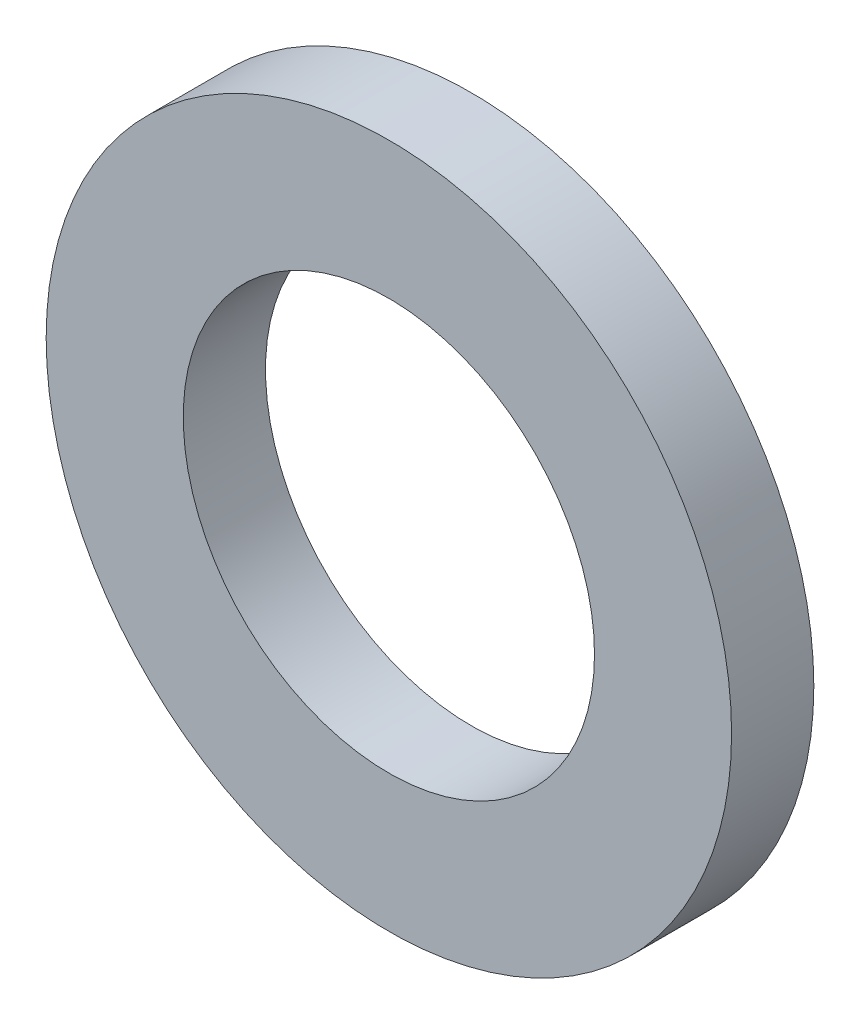
ISO-10303-21;
HEADER;
FILE_DESCRIPTION(('STEP AP214'),'2;1');
FILE_NAME('part.step','',(''),(''),'','','');
FILE_SCHEMA(('AUTOMOTIVE_DESIGN { 1 0 10303 214 1 1 1 1 }'));
ENDSEC;
DATA;
#1=APPLICATION_CONTEXT('core data for automotive mechanical design processes');
#2=APPLICATION_PROTOCOL_DEFINITION('international standard','automotive_design',2000,#1);
#3=PRODUCT_CONTEXT('',#1,'mechanical');
#4=PRODUCT('Part','Part','',(#3));
#5=PRODUCT_RELATED_PRODUCT_CATEGORY('part','',(#4));
#6=PRODUCT_DEFINITION_FORMATION('','',#4);
#7=PRODUCT_DEFINITION_CONTEXT('part definition',#1,'design');
#8=PRODUCT_DEFINITION('design','',#6,#7);
#9=PRODUCT_DEFINITION_SHAPE('','',#8);
#10=(LENGTH_UNIT() NAMED_UNIT(*) SI_UNIT(.MILLI.,.METRE.));
#11=(NAMED_UNIT(*) PLANE_ANGLE_UNIT() SI_UNIT($,.RADIAN.));
#12=(NAMED_UNIT(*) SI_UNIT($,.STERADIAN.) SOLID_ANGLE_UNIT());
#13=UNCERTAINTY_MEASURE_WITH_UNIT(LENGTH_MEASURE(1.E-05),#10,'distance_accuracy_value','');
#14=(GEOMETRIC_REPRESENTATION_CONTEXT(3) GLOBAL_UNCERTAINTY_ASSIGNED_CONTEXT((#13)) GLOBAL_UNIT_ASSIGNED_CONTEXT((#10,
#11,#12)) REPRESENTATION_CONTEXT('',''));
#15=CARTESIAN_POINT('',(0.,0.,0.));
#16=DIRECTION('',(0.,0.,1.));
#17=DIRECTION('',(1.,0.,0.));
#18=AXIS2_PLACEMENT_3D('',#15,#16,#17);
#19=CARTESIAN_POINT('',(0.,0.,3.));
#20=DIRECTION('',(0.,0.,1.));
#21=DIRECTION('',(1.,0.,0.));
#22=AXIS2_PLACEMENT_3D('',#19,#20,#21);
#23=PLANE('',#22);
#24=CARTESIAN_POINT('',(0.,0.,3.));
#25=DIRECTION('',(0.,0.,1.));
#26=DIRECTION('',(1.,0.,0.));
#27=AXIS2_PLACEMENT_3D('',#24,#25,#26);
#28=CIRCLE('',#27,12.5);
#29=CARTESIAN_POINT('',(12.5,0.,3.));
#30=VERTEX_POINT('',#29);
#31=EDGE_CURVE('E10',#30,#30,#28,.T.);
#32=ORIENTED_EDGE('',*,*,#31,.T.);
#33=EDGE_LOOP('',(#32));
#34=FACE_BOUND('',#33,.T.);
#35=CARTESIAN_POINT('',(0.,0.,3.));
#36=DIRECTION('',(0.,0.,1.));
#37=DIRECTION('',(1.,0.,0.));
#38=AXIS2_PLACEMENT_3D('',#35,#36,#37);
#39=CIRCLE('',#38,7.5);
#40=CARTESIAN_POINT('',(7.5,0.,3.));
#41=VERTEX_POINT('',#40);
#42=EDGE_CURVE('E43',#41,#41,#39,.T.);
#43=ORIENTED_EDGE('',*,*,#42,.F.);
#44=EDGE_LOOP('',(#43));
#45=FACE_BOUND('',#44,.T.);
#46=ADVANCED_FACE('F32',(#34,#45),#23,.T.);
#47=CARTESIAN_POINT('',(0.,0.,0.));
#48=DIRECTION('',(0.,0.,1.));
#49=DIRECTION('',(1.,0.,0.));
#50=AXIS2_PLACEMENT_3D('',#47,#48,#49);
#51=PLANE('',#50);
#52=CARTESIAN_POINT('',(0.,0.,0.));
#53=DIRECTION('',(0.,0.,1.));
#54=DIRECTION('',(1.,0.,0.));
#55=AXIS2_PLACEMENT_3D('',#52,#53,#54);
#56=CIRCLE('',#55,12.5);
#57=CARTESIAN_POINT('',(12.5,0.,0.));
#58=VERTEX_POINT('',#57);
#59=EDGE_CURVE('E36',#58,#58,#56,.T.);
#60=ORIENTED_EDGE('',*,*,#59,.F.);
#61=EDGE_LOOP('',(#60));
#62=FACE_BOUND('',#61,.T.);
#63=CARTESIAN_POINT('',(0.,0.,0.));
#64=DIRECTION('',(0.,0.,1.));
#65=DIRECTION('',(1.,0.,0.));
#66=AXIS2_PLACEMENT_3D('',#63,#64,#65);
#67=CIRCLE('',#66,7.5);
#68=CARTESIAN_POINT('',(7.5,0.,0.));
#69=VERTEX_POINT('',#68);
#70=EDGE_CURVE('E45',#69,#69,#67,.T.);
#71=ORIENTED_EDGE('',*,*,#70,.T.);
#72=EDGE_LOOP('',(#71));
#73=FACE_BOUND('',#72,.T.);
#74=ADVANCED_FACE('F55',(#62,#73),#51,.F.);
#75=CARTESIAN_POINT('',(0.,0.,3.));
#76=DIRECTION('',(0.,0.,-1.));
#77=DIRECTION('',(-1.,0.,0.));
#78=AXIS2_PLACEMENT_3D('',#75,#76,#77);
#79=CYLINDRICAL_SURFACE('',#78,12.5);
#80=ORIENTED_EDGE('',*,*,#31,.F.);
#81=EDGE_LOOP('',(#80));
#82=FACE_BOUND('',#81,.T.);
#83=ORIENTED_EDGE('',*,*,#59,.T.);
#84=EDGE_LOOP('',(#83));
#85=FACE_BOUND('',#84,.T.);
#86=ADVANCED_FACE('F34',(#82,#85),#79,.T.);
#87=CARTESIAN_POINT('',(0.,0.,3.));
#88=DIRECTION('',(0.,0.,-1.));
#89=DIRECTION('',(-1.,0.,0.));
#90=AXIS2_PLACEMENT_3D('',#87,#88,#89);
#91=CYLINDRICAL_SURFACE('',#90,7.5);
#92=ORIENTED_EDGE('',*,*,#42,.T.);
#93=EDGE_LOOP('',(#92));
#94=FACE_BOUND('',#93,.T.);
#95=ORIENTED_EDGE('',*,*,#70,.F.);
#96=EDGE_LOOP('',(#95));
#97=FACE_BOUND('',#96,.T.);
#98=ADVANCED_FACE('F51',(#94,#97),#91,.F.);
#99=CLOSED_SHELL('',(#46,#74,#86,#98));
#100=MANIFOLD_SOLID_BREP('B2',#99);
#101=ADVANCED_BREP_SHAPE_REPRESENTATION('',(#18,#100),#14);
#102=SHAPE_DEFINITION_REPRESENTATION(#9,#101);
ENDSEC;
END-ISO-10303-21;
